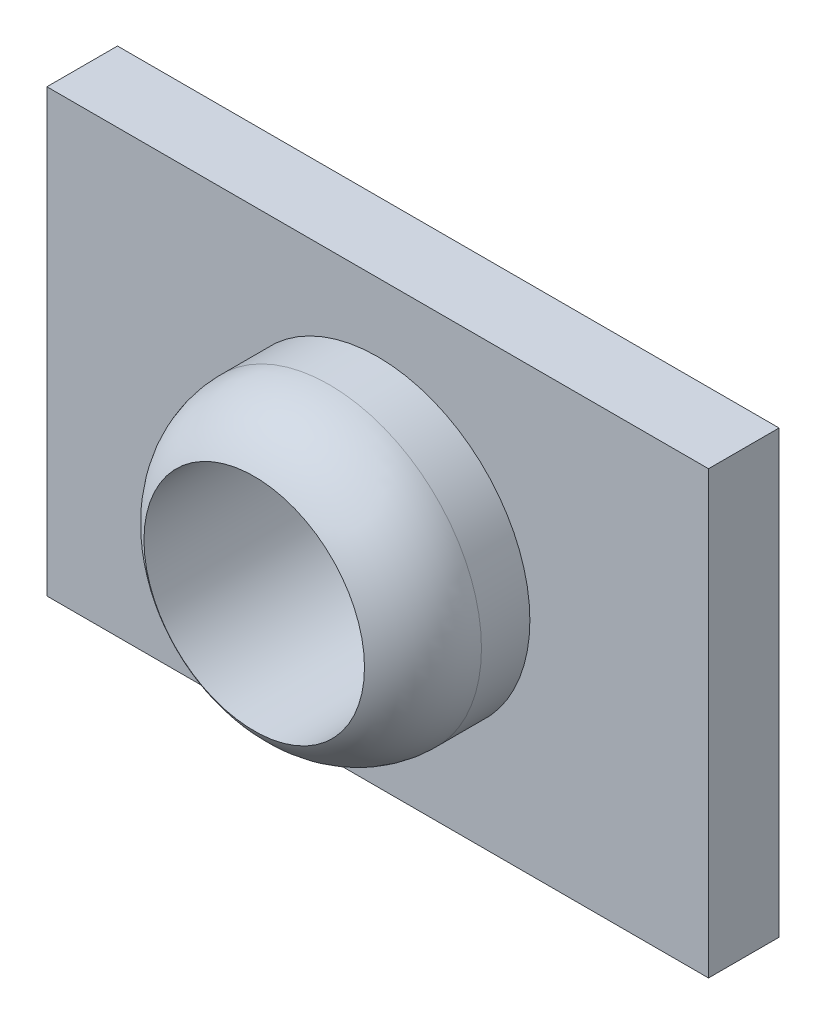
ISO-10303-21;
HEADER;
FILE_DESCRIPTION(('STEP AP214'),'2;1');
FILE_NAME('part.step','',(''),(''),'','','');
FILE_SCHEMA(('AUTOMOTIVE_DESIGN { 1 0 10303 214 1 1 1 1 }'));
ENDSEC;
DATA;
#1=APPLICATION_CONTEXT('core data for automotive mechanical design processes');
#2=APPLICATION_PROTOCOL_DEFINITION('international standard','automotive_design',2000,#1);
#3=PRODUCT_CONTEXT('',#1,'mechanical');
#4=PRODUCT('Part','Part','',(#3));
#5=PRODUCT_RELATED_PRODUCT_CATEGORY('part','',(#4));
#6=PRODUCT_DEFINITION_FORMATION('','',#4);
#7=PRODUCT_DEFINITION_CONTEXT('part definition',#1,'design');
#8=PRODUCT_DEFINITION('design','',#6,#7);
#9=PRODUCT_DEFINITION_SHAPE('','',#8);
#10=(LENGTH_UNIT() NAMED_UNIT(*) SI_UNIT(.MILLI.,.METRE.));
#11=(NAMED_UNIT(*) PLANE_ANGLE_UNIT() SI_UNIT($,.RADIAN.));
#12=(NAMED_UNIT(*) SI_UNIT($,.STERADIAN.) SOLID_ANGLE_UNIT());
#13=UNCERTAINTY_MEASURE_WITH_UNIT(LENGTH_MEASURE(1.E-05),#10,'distance_accuracy_value','');
#14=(GEOMETRIC_REPRESENTATION_CONTEXT(3) GLOBAL_UNCERTAINTY_ASSIGNED_CONTEXT((#13)) GLOBAL_UNIT_ASSIGNED_CONTEXT((#10,
#11,#12)) REPRESENTATION_CONTEXT('',''));
#15=CARTESIAN_POINT('',(0.,0.,0.));
#16=DIRECTION('',(0.,0.,1.));
#17=DIRECTION('',(1.,0.,0.));
#18=AXIS2_PLACEMENT_3D('',#15,#16,#17);
#19=CARTESIAN_POINT('',(0.,0.,4.4));
#20=DIRECTION('',(0.,0.,-1.));
#21=DIRECTION('',(-1.,0.,0.));
#22=AXIS2_PLACEMENT_3D('',#19,#20,#21);
#23=CYLINDRICAL_SURFACE('',#22,2.5);
#24=CARTESIAN_POINT('',(0.,0.,4.4));
#25=DIRECTION('',(0.,0.,1.));
#26=DIRECTION('',(1.,0.,0.));
#27=AXIS2_PLACEMENT_3D('',#24,#25,#26);
#28=CIRCLE('',#27,2.5);
#29=CARTESIAN_POINT('',(2.5,0.,4.4));
#30=VERTEX_POINT('',#29);
#31=EDGE_CURVE('E42',#30,#30,#28,.T.);
#32=ORIENTED_EDGE('',*,*,#31,.T.);
#33=EDGE_LOOP('',(#32));
#34=FACE_BOUND('',#33,.T.);
#35=CARTESIAN_POINT('',(0.,0.,0.));
#36=DIRECTION('',(0.,0.,1.));
#37=DIRECTION('',(1.,0.,0.));
#38=AXIS2_PLACEMENT_3D('',#35,#36,#37);
#39=CIRCLE('',#38,2.5);
#40=CARTESIAN_POINT('',(2.5,0.,0.));
#41=VERTEX_POINT('',#40);
#42=EDGE_CURVE('E113',#41,#41,#39,.T.);
#43=ORIENTED_EDGE('',*,*,#42,.F.);
#44=EDGE_LOOP('',(#43));
#45=FACE_BOUND('',#44,.T.);
#46=ADVANCED_FACE('F33',(#34,#45),#23,.F.);
#47=CARTESIAN_POINT('',(0.,0.,4.4));
#48=DIRECTION('',(0.,0.,-1.));
#49=DIRECTION('',(-1.,0.,0.));
#50=AXIS2_PLACEMENT_3D('',#47,#48,#49);
#51=CYLINDRICAL_SURFACE('',#50,3.45);
#52=CARTESIAN_POINT('',(0.,0.,2.69779554694508));
#53=DIRECTION('',(0.,0.,1.));
#54=DIRECTION('',(1.,0.,0.));
#55=AXIS2_PLACEMENT_3D('',#52,#53,#54);
#56=CIRCLE('',#55,3.45);
#57=CARTESIAN_POINT('',(3.45,0.,2.69779554694508));
#58=VERTEX_POINT('',#57);
#59=EDGE_CURVE('E11',#58,#58,#56,.F.);
#60=ORIENTED_EDGE('',*,*,#59,.T.);
#61=EDGE_LOOP('',(#60));
#62=FACE_BOUND('',#61,.T.);
#63=CARTESIAN_POINT('',(0.,0.,1.6));
#64=DIRECTION('',(0.,0.,1.));
#65=DIRECTION('',(1.,0.,0.));
#66=AXIS2_PLACEMENT_3D('',#63,#64,#65);
#67=CIRCLE('',#66,3.45);
#68=CARTESIAN_POINT('',(3.45,0.,1.6));
#69=VERTEX_POINT('',#68);
#70=EDGE_CURVE('E109',#69,#69,#67,.T.);
#71=ORIENTED_EDGE('',*,*,#70,.T.);
#72=EDGE_LOOP('',(#71));
#73=FACE_BOUND('',#72,.T.);
#74=ADVANCED_FACE('F122',(#62,#73),#51,.T.);
#75=CARTESIAN_POINT('',(0.,0.,0.));
#76=DIRECTION('',(0.,0.,1.));
#77=DIRECTION('',(1.,0.,0.));
#78=AXIS2_PLACEMENT_3D('',#75,#76,#77);
#79=PLANE('',#78);
#80=ORIENTED_EDGE('',*,*,#42,.T.);
#81=EDGE_LOOP('',(#80));
#82=FACE_BOUND('',#81,.T.);
#83=DIRECTION('',(1.,0.,0.));
#84=VECTOR('',#83,1.);
#85=CARTESIAN_POINT('',(0.,-5.,0.));
#86=LINE('',#85,#84);
#87=CARTESIAN_POINT('',(-7.5,-5.,0.));
#88=VERTEX_POINT('',#87);
#89=CARTESIAN_POINT('',(7.5,-5.,0.));
#90=VERTEX_POINT('',#89);
#91=EDGE_CURVE('E101',#88,#90,#86,.T.);
#92=ORIENTED_EDGE('',*,*,#91,.F.);
#93=DIRECTION('',(0.,1.,0.));
#94=VECTOR('',#93,1.);
#95=CARTESIAN_POINT('',(-7.5,0.,0.));
#96=LINE('',#95,#94);
#97=CARTESIAN_POINT('',(-7.5,5.,0.));
#98=VERTEX_POINT('',#97);
#99=EDGE_CURVE('E106',#88,#98,#96,.T.);
#100=ORIENTED_EDGE('',*,*,#99,.T.);
#101=DIRECTION('',(1.,0.,0.));
#102=VECTOR('',#101,1.);
#103=CARTESIAN_POINT('',(0.,5.,0.));
#104=LINE('',#103,#102);
#105=CARTESIAN_POINT('',(7.5,5.,0.));
#106=VERTEX_POINT('',#105);
#107=EDGE_CURVE('E104',#98,#106,#104,.T.);
#108=ORIENTED_EDGE('',*,*,#107,.T.);
#109=DIRECTION('',(0.,1.,0.));
#110=VECTOR('',#109,1.);
#111=CARTESIAN_POINT('',(7.5,0.,0.));
#112=LINE('',#111,#110);
#113=EDGE_CURVE('E90',#90,#106,#112,.T.);
#114=ORIENTED_EDGE('',*,*,#113,.F.);
#115=EDGE_LOOP('',(#92,#100,#108,#114));
#116=FACE_BOUND('',#115,.T.);
#117=ADVANCED_FACE('F118',(#82,#116),#79,.F.);
#118=CARTESIAN_POINT('',(0.,-5.,1.6));
#119=DIRECTION('',(0.,1.,0.));
#120=DIRECTION('',(0.,0.,1.));
#121=AXIS2_PLACEMENT_3D('',#118,#119,#120);
#122=PLANE('',#121);
#123=ORIENTED_EDGE('',*,*,#91,.T.);
#124=DIRECTION('',(0.,0.,-1.));
#125=VECTOR('',#124,1.);
#126=CARTESIAN_POINT('',(7.5,-5.,1.6));
#127=LINE('',#126,#125);
#128=CARTESIAN_POINT('',(7.5,-5.,1.6));
#129=VERTEX_POINT('',#128);
#130=EDGE_CURVE('E93',#129,#90,#127,.T.);
#131=ORIENTED_EDGE('',*,*,#130,.F.);
#132=DIRECTION('',(1.,0.,0.));
#133=VECTOR('',#132,1.);
#134=CARTESIAN_POINT('',(0.,-5.,1.6));
#135=LINE('',#134,#133);
#136=CARTESIAN_POINT('',(-7.5,-5.,1.6));
#137=VERTEX_POINT('',#136);
#138=EDGE_CURVE('E84',#137,#129,#135,.T.);
#139=ORIENTED_EDGE('',*,*,#138,.F.);
#140=DIRECTION('',(0.,0.,-1.));
#141=VECTOR('',#140,1.);
#142=CARTESIAN_POINT('',(-7.5,-5.,1.6));
#143=LINE('',#142,#141);
#144=EDGE_CURVE('E50',#137,#88,#143,.T.);
#145=ORIENTED_EDGE('',*,*,#144,.T.);
#146=EDGE_LOOP('',(#123,#131,#139,#145));
#147=FACE_BOUND('',#146,.T.);
#148=ADVANCED_FACE('F133',(#147),#122,.F.);
#149=CARTESIAN_POINT('',(7.5,0.,1.6));
#150=DIRECTION('',(-1.,0.,0.));
#151=DIRECTION('',(0.,-1.,0.));
#152=AXIS2_PLACEMENT_3D('',#149,#150,#151);
#153=PLANE('',#152);
#154=ORIENTED_EDGE('',*,*,#113,.T.);
#155=DIRECTION('',(0.,0.,-1.));
#156=VECTOR('',#155,1.);
#157=CARTESIAN_POINT('',(7.5,5.,1.6));
#158=LINE('',#157,#156);
#159=CARTESIAN_POINT('',(7.5,5.,1.6));
#160=VERTEX_POINT('',#159);
#161=EDGE_CURVE('E88',#160,#106,#158,.T.);
#162=ORIENTED_EDGE('',*,*,#161,.F.);
#163=DIRECTION('',(0.,1.,0.));
#164=VECTOR('',#163,1.);
#165=CARTESIAN_POINT('',(7.5,0.,1.6));
#166=LINE('',#165,#164);
#167=EDGE_CURVE('E76',#129,#160,#166,.T.);
#168=ORIENTED_EDGE('',*,*,#167,.F.);
#169=ORIENTED_EDGE('',*,*,#130,.T.);
#170=EDGE_LOOP('',(#154,#162,#168,#169));
#171=FACE_BOUND('',#170,.T.);
#172=ADVANCED_FACE('F89',(#171),#153,.F.);
#173=CARTESIAN_POINT('',(0.,5.,1.6));
#174=DIRECTION('',(0.,1.,0.));
#175=DIRECTION('',(0.,0.,1.));
#176=AXIS2_PLACEMENT_3D('',#173,#174,#175);
#177=PLANE('',#176);
#178=ORIENTED_EDGE('',*,*,#107,.F.);
#179=DIRECTION('',(0.,0.,-1.));
#180=VECTOR('',#179,1.);
#181=CARTESIAN_POINT('',(-7.5,5.,1.6));
#182=LINE('',#181,#180);
#183=CARTESIAN_POINT('',(-7.5,5.,1.6));
#184=VERTEX_POINT('',#183);
#185=EDGE_CURVE('E64',#184,#98,#182,.T.);
#186=ORIENTED_EDGE('',*,*,#185,.F.);
#187=DIRECTION('',(1.,0.,0.));
#188=VECTOR('',#187,1.);
#189=CARTESIAN_POINT('',(0.,5.,1.6));
#190=LINE('',#189,#188);
#191=EDGE_CURVE('E83',#184,#160,#190,.T.);
#192=ORIENTED_EDGE('',*,*,#191,.T.);
#193=ORIENTED_EDGE('',*,*,#161,.T.);
#194=EDGE_LOOP('',(#178,#186,#192,#193));
#195=FACE_BOUND('',#194,.T.);
#196=ADVANCED_FACE('F95',(#195),#177,.T.);
#197=CARTESIAN_POINT('',(-7.5,0.,1.6));
#198=DIRECTION('',(-1.,0.,0.));
#199=DIRECTION('',(0.,-1.,0.));
#200=AXIS2_PLACEMENT_3D('',#197,#198,#199);
#201=PLANE('',#200);
#202=ORIENTED_EDGE('',*,*,#99,.F.);
#203=ORIENTED_EDGE('',*,*,#144,.F.);
#204=DIRECTION('',(0.,1.,0.));
#205=VECTOR('',#204,1.);
#206=CARTESIAN_POINT('',(-7.5,0.,1.6));
#207=LINE('',#206,#205);
#208=EDGE_CURVE('E96',#137,#184,#207,.T.);
#209=ORIENTED_EDGE('',*,*,#208,.T.);
#210=ORIENTED_EDGE('',*,*,#185,.T.);
#211=EDGE_LOOP('',(#202,#203,#209,#210));
#212=FACE_BOUND('',#211,.T.);
#213=ADVANCED_FACE('F140',(#212),#201,.T.);
#214=CARTESIAN_POINT('',(0.,0.,1.6));
#215=DIRECTION('',(0.,0.,1.));
#216=DIRECTION('',(1.,0.,0.));
#217=AXIS2_PLACEMENT_3D('',#214,#215,#216);
#218=PLANE('',#217);
#219=ORIENTED_EDGE('',*,*,#70,.F.);
#220=EDGE_LOOP('',(#219));
#221=FACE_BOUND('',#220,.T.);
#222=ORIENTED_EDGE('',*,*,#138,.T.);
#223=ORIENTED_EDGE('',*,*,#167,.T.);
#224=ORIENTED_EDGE('',*,*,#191,.F.);
#225=ORIENTED_EDGE('',*,*,#208,.F.);
#226=EDGE_LOOP('',(#222,#223,#224,#225));
#227=FACE_BOUND('',#226,.T.);
#228=ADVANCED_FACE('F80',(#221,#227),#218,.T.);
#229=CARTESIAN_POINT('',(0.,0.,2.69779554694508));
#230=DIRECTION('',(0.,0.,1.));
#231=DIRECTION('',(1.,0.,0.));
#232=AXIS2_PLACEMENT_3D('',#229,#230,#231);
#233=DEGENERATE_TOROIDAL_SURFACE('',#232,1.45,2.,.T.);
#234=ORIENTED_EDGE('',*,*,#59,.F.);
#235=EDGE_LOOP('',(#234));
#236=FACE_BOUND('',#235,.T.);
#237=ORIENTED_EDGE('',*,*,#31,.F.);
#238=EDGE_LOOP('',(#237));
#239=FACE_BOUND('',#238,.T.);
#240=ADVANCED_FACE('F35',(#236,#239),#233,.T.);
#241=CLOSED_SHELL('',(#46,#74,#117,#148,#172,#196,#213,#228,#240));
#242=MANIFOLD_SOLID_BREP('B2',#241);
#243=ADVANCED_BREP_SHAPE_REPRESENTATION('',(#18,#242),#14);
#244=SHAPE_DEFINITION_REPRESENTATION(#9,#243);
ENDSEC;
END-ISO-10303-21;
